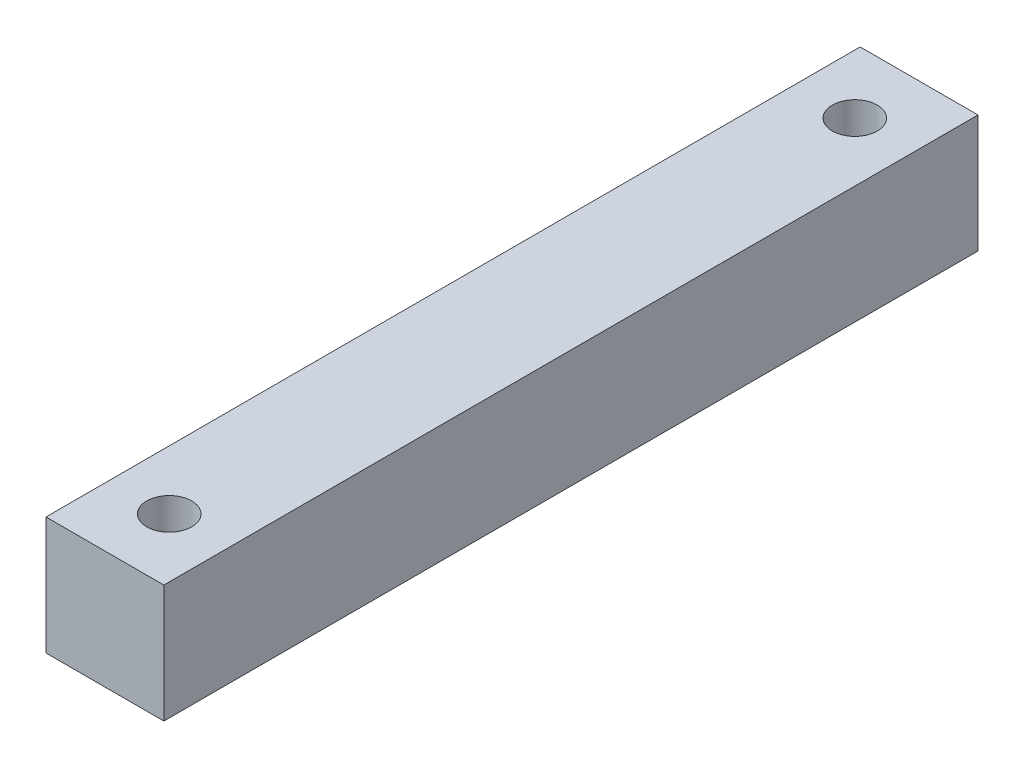
ISO-10303-21;
HEADER;
FILE_DESCRIPTION(('STEP AP214'),'2;1');
FILE_NAME('part.step','',(''),(''),'','','');
FILE_SCHEMA(('AUTOMOTIVE_DESIGN { 1 0 10303 214 1 1 1 1 }'));
ENDSEC;
DATA;
#1=APPLICATION_CONTEXT('core data for automotive mechanical design processes');
#2=APPLICATION_PROTOCOL_DEFINITION('international standard','automotive_design',2000,#1);
#3=PRODUCT_CONTEXT('',#1,'mechanical');
#4=PRODUCT('Part','Part','',(#3));
#5=PRODUCT_RELATED_PRODUCT_CATEGORY('part','',(#4));
#6=PRODUCT_DEFINITION_FORMATION('','',#4);
#7=PRODUCT_DEFINITION_CONTEXT('part definition',#1,'design');
#8=PRODUCT_DEFINITION('design','',#6,#7);
#9=PRODUCT_DEFINITION_SHAPE('','',#8);
#10=(LENGTH_UNIT() NAMED_UNIT(*) SI_UNIT(.MILLI.,.METRE.));
#11=(NAMED_UNIT(*) PLANE_ANGLE_UNIT() SI_UNIT($,.RADIAN.));
#12=(NAMED_UNIT(*) SI_UNIT($,.STERADIAN.) SOLID_ANGLE_UNIT());
#13=UNCERTAINTY_MEASURE_WITH_UNIT(LENGTH_MEASURE(1.E-05),#10,'distance_accuracy_value','');
#14=(GEOMETRIC_REPRESENTATION_CONTEXT(3) GLOBAL_UNCERTAINTY_ASSIGNED_CONTEXT((#13)) GLOBAL_UNIT_ASSIGNED_CONTEXT((#10,
#11,#12)) REPRESENTATION_CONTEXT('',''));
#15=CARTESIAN_POINT('',(0.,0.,0.));
#16=DIRECTION('',(0.,0.,1.));
#17=DIRECTION('',(1.,0.,0.));
#18=AXIS2_PLACEMENT_3D('',#15,#16,#17);
#19=CARTESIAN_POINT('',(-2.75,2.75,38.));
#20=DIRECTION('',(1.,0.,0.));
#21=DIRECTION('',(0.,0.,-1.));
#22=AXIS2_PLACEMENT_3D('',#19,#20,#21);
#23=PLANE('',#22);
#24=DIRECTION('',(0.,-1.,0.));
#25=VECTOR('',#24,1.);
#26=CARTESIAN_POINT('',(-2.75,2.75,0.));
#27=LINE('',#26,#25);
#28=CARTESIAN_POINT('',(-2.75,2.75,0.));
#29=VERTEX_POINT('',#28);
#30=CARTESIAN_POINT('',(-2.75,-2.75,0.));
#31=VERTEX_POINT('',#30);
#32=EDGE_CURVE('E96',#29,#31,#27,.T.);
#33=ORIENTED_EDGE('',*,*,#32,.T.);
#34=DIRECTION('',(0.,0.,-1.));
#35=VECTOR('',#34,1.);
#36=CARTESIAN_POINT('',(-2.75,-2.75,38.));
#37=LINE('',#36,#35);
#38=CARTESIAN_POINT('',(-2.75,-2.75,38.));
#39=VERTEX_POINT('',#38);
#40=EDGE_CURVE('E11',#39,#31,#37,.T.);
#41=ORIENTED_EDGE('',*,*,#40,.F.);
#42=DIRECTION('',(0.,-1.,0.));
#43=VECTOR('',#42,1.);
#44=CARTESIAN_POINT('',(-2.75,2.75,38.));
#45=LINE('',#44,#43);
#46=CARTESIAN_POINT('',(-2.75,2.75,38.));
#47=VERTEX_POINT('',#46);
#48=EDGE_CURVE('E84',#47,#39,#45,.T.);
#49=ORIENTED_EDGE('',*,*,#48,.F.);
#50=DIRECTION('',(0.,0.,-1.));
#51=VECTOR('',#50,1.);
#52=CARTESIAN_POINT('',(-2.75,2.75,38.));
#53=LINE('',#52,#51);
#54=EDGE_CURVE('E92',#47,#29,#53,.T.);
#55=ORIENTED_EDGE('',*,*,#54,.T.);
#56=EDGE_LOOP('',(#33,#41,#49,#55));
#57=FACE_BOUND('',#56,.T.);
#58=ADVANCED_FACE('F33',(#57),#23,.F.);
#59=CARTESIAN_POINT('',(2.75,-2.75,38.));
#60=DIRECTION('',(0.,1.,0.));
#61=DIRECTION('',(-1.,0.,0.));
#62=AXIS2_PLACEMENT_3D('',#59,#60,#61);
#63=PLANE('',#62);
#64=CARTESIAN_POINT('',(0.,-2.75,3.));
#65=DIRECTION('',(0.,1.,0.));
#66=DIRECTION('',(-1.,0.,0.));
#67=AXIS2_PLACEMENT_3D('',#64,#65,#66);
#68=CIRCLE('',#67,1.05);
#69=CARTESIAN_POINT('',(-1.05,-2.75,3.));
#70=VERTEX_POINT('',#69);
#71=EDGE_CURVE('E99',#70,#70,#68,.T.);
#72=ORIENTED_EDGE('',*,*,#71,.T.);
#73=EDGE_LOOP('',(#72));
#74=FACE_BOUND('',#73,.T.);
#75=CARTESIAN_POINT('',(0.,-2.75,35.));
#76=DIRECTION('',(0.,1.,0.));
#77=DIRECTION('',(-1.,0.,0.));
#78=AXIS2_PLACEMENT_3D('',#75,#76,#77);
#79=CIRCLE('',#78,1.05);
#80=CARTESIAN_POINT('',(-1.05,-2.75,35.));
#81=VERTEX_POINT('',#80);
#82=EDGE_CURVE('E113',#81,#81,#79,.T.);
#83=ORIENTED_EDGE('',*,*,#82,.T.);
#84=EDGE_LOOP('',(#83));
#85=FACE_BOUND('',#84,.T.);
#86=DIRECTION('',(1.,0.,0.));
#87=VECTOR('',#86,1.);
#88=CARTESIAN_POINT('',(2.75,-2.75,0.));
#89=LINE('',#88,#87);
#90=CARTESIAN_POINT('',(2.75,-2.75,0.));
#91=VERTEX_POINT('',#90);
#92=EDGE_CURVE('E88',#31,#91,#89,.T.);
#93=ORIENTED_EDGE('',*,*,#92,.T.);
#94=DIRECTION('',(0.,0.,-1.));
#95=VECTOR('',#94,1.);
#96=CARTESIAN_POINT('',(2.75,-2.75,38.));
#97=LINE('',#96,#95);
#98=CARTESIAN_POINT('',(2.75,-2.75,38.));
#99=VERTEX_POINT('',#98);
#100=EDGE_CURVE('E41',#99,#91,#97,.T.);
#101=ORIENTED_EDGE('',*,*,#100,.F.);
#102=DIRECTION('',(1.,0.,0.));
#103=VECTOR('',#102,1.);
#104=CARTESIAN_POINT('',(2.75,-2.75,38.));
#105=LINE('',#104,#103);
#106=EDGE_CURVE('E79',#39,#99,#105,.T.);
#107=ORIENTED_EDGE('',*,*,#106,.F.);
#108=ORIENTED_EDGE('',*,*,#40,.T.);
#109=EDGE_LOOP('',(#93,#101,#107,#108));
#110=FACE_BOUND('',#109,.T.);
#111=ADVANCED_FACE('F87',(#74,#85,#110),#63,.F.);
#112=CARTESIAN_POINT('',(2.75,2.75,38.));
#113=DIRECTION('',(-1.,0.,0.));
#114=DIRECTION('',(0.,-1.,0.));
#115=AXIS2_PLACEMENT_3D('',#112,#113,#114);
#116=PLANE('',#115);
#117=DIRECTION('',(0.,1.,0.));
#118=VECTOR('',#117,1.);
#119=CARTESIAN_POINT('',(2.75,2.75,0.));
#120=LINE('',#119,#118);
#121=CARTESIAN_POINT('',(2.75,2.75,0.));
#122=VERTEX_POINT('',#121);
#123=EDGE_CURVE('E66',#91,#122,#120,.T.);
#124=ORIENTED_EDGE('',*,*,#123,.T.);
#125=DIRECTION('',(0.,0.,-1.));
#126=VECTOR('',#125,1.);
#127=CARTESIAN_POINT('',(2.75,2.75,38.));
#128=LINE('',#127,#126);
#129=CARTESIAN_POINT('',(2.75,2.75,38.));
#130=VERTEX_POINT('',#129);
#131=EDGE_CURVE('E89',#130,#122,#128,.T.);
#132=ORIENTED_EDGE('',*,*,#131,.F.);
#133=DIRECTION('',(0.,1.,0.));
#134=VECTOR('',#133,1.);
#135=CARTESIAN_POINT('',(2.75,2.75,38.));
#136=LINE('',#135,#134);
#137=EDGE_CURVE('E82',#99,#130,#136,.T.);
#138=ORIENTED_EDGE('',*,*,#137,.F.);
#139=ORIENTED_EDGE('',*,*,#100,.T.);
#140=EDGE_LOOP('',(#124,#132,#138,#139));
#141=FACE_BOUND('',#140,.T.);
#142=ADVANCED_FACE('F90',(#141),#116,.F.);
#143=CARTESIAN_POINT('',(2.75,2.75,38.));
#144=DIRECTION('',(0.,-1.,0.));
#145=DIRECTION('',(1.,0.,0.));
#146=AXIS2_PLACEMENT_3D('',#143,#144,#145);
#147=PLANE('',#146);
#148=CARTESIAN_POINT('',(0.,2.75,3.));
#149=DIRECTION('',(0.,1.,0.));
#150=DIRECTION('',(-1.,0.,0.));
#151=AXIS2_PLACEMENT_3D('',#148,#149,#150);
#152=CIRCLE('',#151,1.05);
#153=CARTESIAN_POINT('',(-1.05,2.75,3.));
#154=VERTEX_POINT('',#153);
#155=EDGE_CURVE('E116',#154,#154,#152,.T.);
#156=ORIENTED_EDGE('',*,*,#155,.F.);
#157=EDGE_LOOP('',(#156));
#158=FACE_BOUND('',#157,.T.);
#159=CARTESIAN_POINT('',(0.,2.75,35.));
#160=DIRECTION('',(0.,1.,0.));
#161=DIRECTION('',(-1.,0.,0.));
#162=AXIS2_PLACEMENT_3D('',#159,#160,#161);
#163=CIRCLE('',#162,1.05);
#164=CARTESIAN_POINT('',(-1.05,2.75,35.));
#165=VERTEX_POINT('',#164);
#166=EDGE_CURVE('E110',#165,#165,#163,.T.);
#167=ORIENTED_EDGE('',*,*,#166,.F.);
#168=EDGE_LOOP('',(#167));
#169=FACE_BOUND('',#168,.T.);
#170=DIRECTION('',(-1.,0.,0.));
#171=VECTOR('',#170,1.);
#172=CARTESIAN_POINT('',(2.75,2.75,0.));
#173=LINE('',#172,#171);
#174=EDGE_CURVE('E72',#122,#29,#173,.T.);
#175=ORIENTED_EDGE('',*,*,#174,.T.);
#176=ORIENTED_EDGE('',*,*,#54,.F.);
#177=DIRECTION('',(-1.,0.,0.));
#178=VECTOR('',#177,1.);
#179=CARTESIAN_POINT('',(2.75,2.75,38.));
#180=LINE('',#179,#178);
#181=EDGE_CURVE('E49',#130,#47,#180,.T.);
#182=ORIENTED_EDGE('',*,*,#181,.F.);
#183=ORIENTED_EDGE('',*,*,#131,.T.);
#184=EDGE_LOOP('',(#175,#176,#182,#183));
#185=FACE_BOUND('',#184,.T.);
#186=ADVANCED_FACE('F104',(#158,#169,#185),#147,.F.);
#187=CARTESIAN_POINT('',(0.,0.,38.));
#188=DIRECTION('',(0.,0.,-1.));
#189=DIRECTION('',(-1.,0.,0.));
#190=AXIS2_PLACEMENT_3D('',#187,#188,#189);
#191=PLANE('',#190);
#192=ORIENTED_EDGE('',*,*,#48,.T.);
#193=ORIENTED_EDGE('',*,*,#106,.T.);
#194=ORIENTED_EDGE('',*,*,#137,.T.);
#195=ORIENTED_EDGE('',*,*,#181,.T.);
#196=EDGE_LOOP('',(#192,#193,#194,#195));
#197=FACE_BOUND('',#196,.T.);
#198=ADVANCED_FACE('F80',(#197),#191,.F.);
#199=CARTESIAN_POINT('',(0.,0.,0.));
#200=DIRECTION('',(0.,0.,-1.));
#201=DIRECTION('',(-1.,0.,0.));
#202=AXIS2_PLACEMENT_3D('',#199,#200,#201);
#203=PLANE('',#202);
#204=ORIENTED_EDGE('',*,*,#32,.F.);
#205=ORIENTED_EDGE('',*,*,#174,.F.);
#206=ORIENTED_EDGE('',*,*,#123,.F.);
#207=ORIENTED_EDGE('',*,*,#92,.F.);
#208=EDGE_LOOP('',(#204,#205,#206,#207));
#209=FACE_BOUND('',#208,.T.);
#210=ADVANCED_FACE('F107',(#209),#203,.T.);
#211=CARTESIAN_POINT('',(0.,-2.75,35.));
#212=DIRECTION('',(0.,1.,0.));
#213=DIRECTION('',(-1.,0.,0.));
#214=AXIS2_PLACEMENT_3D('',#211,#212,#213);
#215=CYLINDRICAL_SURFACE('',#214,1.05);
#216=ORIENTED_EDGE('',*,*,#82,.F.);
#217=EDGE_LOOP('',(#216));
#218=FACE_BOUND('',#217,.T.);
#219=ORIENTED_EDGE('',*,*,#166,.T.);
#220=EDGE_LOOP('',(#219));
#221=FACE_BOUND('',#220,.T.);
#222=ADVANCED_FACE('F127',(#218,#221),#215,.F.);
#223=CARTESIAN_POINT('',(0.,-2.75,3.));
#224=DIRECTION('',(0.,1.,0.));
#225=DIRECTION('',(-1.,0.,0.));
#226=AXIS2_PLACEMENT_3D('',#223,#224,#225);
#227=CYLINDRICAL_SURFACE('',#226,1.05);
#228=ORIENTED_EDGE('',*,*,#71,.F.);
#229=EDGE_LOOP('',(#228));
#230=FACE_BOUND('',#229,.T.);
#231=ORIENTED_EDGE('',*,*,#155,.T.);
#232=EDGE_LOOP('',(#231));
#233=FACE_BOUND('',#232,.T.);
#234=ADVANCED_FACE('F124',(#230,#233),#227,.F.);
#235=CLOSED_SHELL('',(#58,#111,#142,#186,#198,#210,#222,#234));
#236=MANIFOLD_SOLID_BREP('B2',#235);
#237=ADVANCED_BREP_SHAPE_REPRESENTATION('',(#18,#236),#14);
#238=SHAPE_DEFINITION_REPRESENTATION(#9,#237);
ENDSEC;
END-ISO-10303-21;
